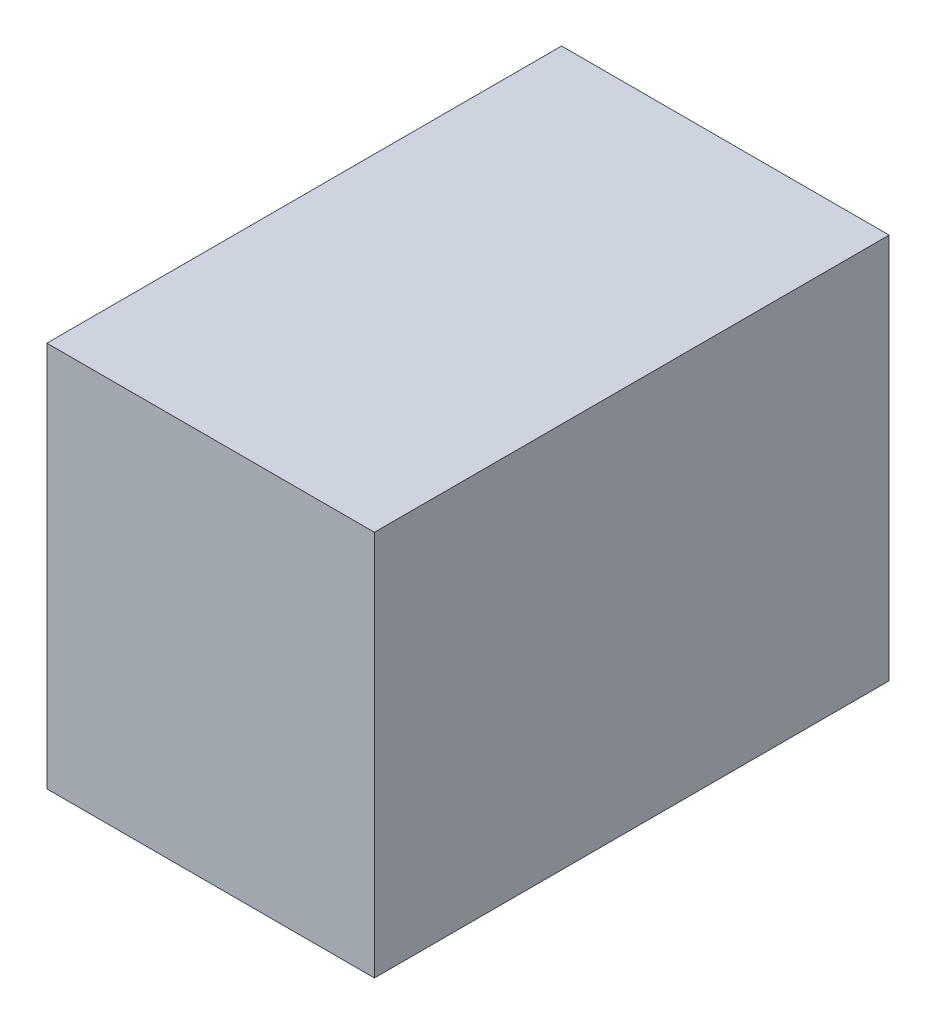
ISO-10303-21;
HEADER;
FILE_DESCRIPTION(('STEP AP214'),'2;1');
FILE_NAME('part.step','',(''),(''),'','','');
FILE_SCHEMA(('AUTOMOTIVE_DESIGN { 1 0 10303 214 1 1 1 1 }'));
ENDSEC;
DATA;
#1=APPLICATION_CONTEXT('core data for automotive mechanical design processes');
#2=APPLICATION_PROTOCOL_DEFINITION('international standard','automotive_design',2000,#1);
#3=PRODUCT_CONTEXT('',#1,'mechanical');
#4=PRODUCT('Part','Part','',(#3));
#5=PRODUCT_RELATED_PRODUCT_CATEGORY('part','',(#4));
#6=PRODUCT_DEFINITION_FORMATION('','',#4);
#7=PRODUCT_DEFINITION_CONTEXT('part definition',#1,'design');
#8=PRODUCT_DEFINITION('design','',#6,#7);
#9=PRODUCT_DEFINITION_SHAPE('','',#8);
#10=(LENGTH_UNIT() NAMED_UNIT(*) SI_UNIT(.MILLI.,.METRE.));
#11=(NAMED_UNIT(*) PLANE_ANGLE_UNIT() SI_UNIT($,.RADIAN.));
#12=(NAMED_UNIT(*) SI_UNIT($,.STERADIAN.) SOLID_ANGLE_UNIT());
#13=UNCERTAINTY_MEASURE_WITH_UNIT(LENGTH_MEASURE(1.E-05),#10,'distance_accuracy_value','');
#14=(GEOMETRIC_REPRESENTATION_CONTEXT(3) GLOBAL_UNCERTAINTY_ASSIGNED_CONTEXT((#13)) GLOBAL_UNIT_ASSIGNED_CONTEXT((#10,
#11,#12)) REPRESENTATION_CONTEXT('',''));
#15=CARTESIAN_POINT('',(0.,0.,0.));
#16=DIRECTION('',(0.,0.,1.));
#17=DIRECTION('',(1.,0.,0.));
#18=AXIS2_PLACEMENT_3D('',#15,#16,#17);
#19=CARTESIAN_POINT('',(-70.,165.,110.));
#20=DIRECTION('',(1.,0.,0.));
#21=DIRECTION('',(0.,0.,-1.));
#22=AXIS2_PLACEMENT_3D('',#19,#20,#21);
#23=PLANE('',#22);
#24=DIRECTION('',(0.,0.,1.));
#25=VECTOR('',#24,1.);
#26=CARTESIAN_POINT('',(-70.,0.,110.));
#27=LINE('',#26,#25);
#28=CARTESIAN_POINT('',(-70.,0.,-110.));
#29=VERTEX_POINT('',#28);
#30=CARTESIAN_POINT('',(-70.,0.,110.));
#31=VERTEX_POINT('',#30);
#32=EDGE_CURVE('E145',#29,#31,#27,.T.);
#33=ORIENTED_EDGE('',*,*,#32,.T.);
#34=DIRECTION('',(0.,-1.,0.));
#35=VECTOR('',#34,1.);
#36=CARTESIAN_POINT('',(-70.,165.,110.));
#37=LINE('',#36,#35);
#38=CARTESIAN_POINT('',(-70.,165.,110.));
#39=VERTEX_POINT('',#38);
#40=EDGE_CURVE('E11',#39,#31,#37,.T.);
#41=ORIENTED_EDGE('',*,*,#40,.F.);
#42=DIRECTION('',(0.,0.,1.));
#43=VECTOR('',#42,1.);
#44=CARTESIAN_POINT('',(-70.,165.,110.));
#45=LINE('',#44,#43);
#46=CARTESIAN_POINT('',(-70.,165.,-110.));
#47=VERTEX_POINT('',#46);
#48=EDGE_CURVE('E175',#47,#39,#45,.T.);
#49=ORIENTED_EDGE('',*,*,#48,.F.);
#50=DIRECTION('',(0.,-1.,0.));
#51=VECTOR('',#50,1.);
#52=CARTESIAN_POINT('',(-70.,165.,-110.));
#53=LINE('',#52,#51);
#54=EDGE_CURVE('E184',#47,#29,#53,.T.);
#55=ORIENTED_EDGE('',*,*,#54,.T.);
#56=EDGE_LOOP('',(#33,#41,#49,#55));
#57=FACE_BOUND('',#56,.T.);
#58=ADVANCED_FACE('F45',(#57),#23,.F.);
#59=CARTESIAN_POINT('',(70.,165.,110.));
#60=DIRECTION('',(0.,0.,-1.));
#61=DIRECTION('',(-1.,0.,0.));
#62=AXIS2_PLACEMENT_3D('',#59,#60,#61);
#63=PLANE('',#62);
#64=DIRECTION('',(1.,0.,0.));
#65=VECTOR('',#64,1.);
#66=CARTESIAN_POINT('',(70.,0.,110.));
#67=LINE('',#66,#65);
#68=CARTESIAN_POINT('',(70.,0.,110.));
#69=VERTEX_POINT('',#68);
#70=EDGE_CURVE('E151',#31,#69,#67,.T.);
#71=ORIENTED_EDGE('',*,*,#70,.T.);
#72=DIRECTION('',(0.,-1.,0.));
#73=VECTOR('',#72,1.);
#74=CARTESIAN_POINT('',(70.,165.,110.));
#75=LINE('',#74,#73);
#76=CARTESIAN_POINT('',(70.,165.,110.));
#77=VERTEX_POINT('',#76);
#78=EDGE_CURVE('E53',#77,#69,#75,.T.);
#79=ORIENTED_EDGE('',*,*,#78,.F.);
#80=DIRECTION('',(1.,0.,0.));
#81=VECTOR('',#80,1.);
#82=CARTESIAN_POINT('',(70.,165.,110.));
#83=LINE('',#82,#81);
#84=EDGE_CURVE('E97',#39,#77,#83,.T.);
#85=ORIENTED_EDGE('',*,*,#84,.F.);
#86=ORIENTED_EDGE('',*,*,#40,.T.);
#87=EDGE_LOOP('',(#71,#79,#85,#86));
#88=FACE_BOUND('',#87,.T.);
#89=ADVANCED_FACE('F219',(#88),#63,.F.);
#90=CARTESIAN_POINT('',(70.,165.,110.));
#91=DIRECTION('',(-1.,0.,0.));
#92=DIRECTION('',(0.,0.,1.));
#93=AXIS2_PLACEMENT_3D('',#90,#91,#92);
#94=PLANE('',#93);
#95=DIRECTION('',(0.,0.,-1.));
#96=VECTOR('',#95,1.);
#97=CARTESIAN_POINT('',(70.,0.,110.));
#98=LINE('',#97,#96);
#99=CARTESIAN_POINT('',(70.,0.,-110.));
#100=VERTEX_POINT('',#99);
#101=EDGE_CURVE('E188',#69,#100,#98,.T.);
#102=ORIENTED_EDGE('',*,*,#101,.T.);
#103=DIRECTION('',(0.,-1.,0.));
#104=VECTOR('',#103,1.);
#105=CARTESIAN_POINT('',(70.,165.,-110.));
#106=LINE('',#105,#104);
#107=CARTESIAN_POINT('',(70.,165.,-110.));
#108=VERTEX_POINT('',#107);
#109=EDGE_CURVE('E195',#108,#100,#106,.T.);
#110=ORIENTED_EDGE('',*,*,#109,.F.);
#111=DIRECTION('',(0.,0.,-1.));
#112=VECTOR('',#111,1.);
#113=CARTESIAN_POINT('',(70.,165.,110.));
#114=LINE('',#113,#112);
#115=EDGE_CURVE('E180',#77,#108,#114,.T.);
#116=ORIENTED_EDGE('',*,*,#115,.F.);
#117=ORIENTED_EDGE('',*,*,#78,.T.);
#118=EDGE_LOOP('',(#102,#110,#116,#117));
#119=FACE_BOUND('',#118,.T.);
#120=ADVANCED_FACE('F202',(#119),#94,.F.);
#121=CARTESIAN_POINT('',(70.,165.,-110.));
#122=DIRECTION('',(0.,0.,1.));
#123=DIRECTION('',(1.,0.,0.));
#124=AXIS2_PLACEMENT_3D('',#121,#122,#123);
#125=PLANE('',#124);
#126=DIRECTION('',(-1.,0.,0.));
#127=VECTOR('',#126,1.);
#128=CARTESIAN_POINT('',(70.,0.,-110.));
#129=LINE('',#128,#127);
#130=EDGE_CURVE('E90',#100,#29,#129,.T.);
#131=ORIENTED_EDGE('',*,*,#130,.T.);
#132=ORIENTED_EDGE('',*,*,#54,.F.);
#133=DIRECTION('',(-1.,0.,0.));
#134=VECTOR('',#133,1.);
#135=CARTESIAN_POINT('',(70.,165.,-110.));
#136=LINE('',#135,#134);
#137=EDGE_CURVE('E69',#108,#47,#136,.T.);
#138=ORIENTED_EDGE('',*,*,#137,.F.);
#139=ORIENTED_EDGE('',*,*,#109,.T.);
#140=EDGE_LOOP('',(#131,#132,#138,#139));
#141=FACE_BOUND('',#140,.T.);
#142=ADVANCED_FACE('F210',(#141),#125,.F.);
#143=CARTESIAN_POINT('',(0.,165.,0.));
#144=DIRECTION('',(0.,1.,0.));
#145=DIRECTION('',(0.,0.,1.));
#146=AXIS2_PLACEMENT_3D('',#143,#144,#145);
#147=PLANE('',#146);
#148=ORIENTED_EDGE('',*,*,#48,.T.);
#149=ORIENTED_EDGE('',*,*,#84,.T.);
#150=ORIENTED_EDGE('',*,*,#115,.T.);
#151=ORIENTED_EDGE('',*,*,#137,.T.);
#152=EDGE_LOOP('',(#148,#149,#150,#151));
#153=FACE_BOUND('',#152,.T.);
#154=ADVANCED_FACE('F212',(#153),#147,.T.);
#155=CARTESIAN_POINT('',(0.,0.,0.));
#156=DIRECTION('',(0.,1.,0.));
#157=DIRECTION('',(0.,0.,1.));
#158=AXIS2_PLACEMENT_3D('',#155,#156,#157);
#159=PLANE('',#158);
#160=DIRECTION('',(-1.,0.,0.));
#161=VECTOR('',#160,1.);
#162=CARTESIAN_POINT('',(70.,0.,-108.));
#163=LINE('',#162,#161);
#164=CARTESIAN_POINT('',(68.,0.,-108.));
#165=VERTEX_POINT('',#164);
#166=CARTESIAN_POINT('',(-68.,0.,-108.));
#167=VERTEX_POINT('',#166);
#168=EDGE_CURVE('E139',#165,#167,#163,.T.);
#169=ORIENTED_EDGE('',*,*,#168,.T.);
#170=DIRECTION('',(0.,0.,1.));
#171=VECTOR('',#170,1.);
#172=CARTESIAN_POINT('',(-68.,0.,110.));
#173=LINE('',#172,#171);
#174=CARTESIAN_POINT('',(-68.,0.,108.));
#175=VERTEX_POINT('',#174);
#176=EDGE_CURVE('E165',#167,#175,#173,.T.);
#177=ORIENTED_EDGE('',*,*,#176,.T.);
#178=DIRECTION('',(1.,0.,0.));
#179=VECTOR('',#178,1.);
#180=CARTESIAN_POINT('',(70.,0.,108.));
#181=LINE('',#180,#179);
#182=CARTESIAN_POINT('',(68.,0.,108.));
#183=VERTEX_POINT('',#182);
#184=EDGE_CURVE('E143',#175,#183,#181,.T.);
#185=ORIENTED_EDGE('',*,*,#184,.T.);
#186=DIRECTION('',(0.,0.,-1.));
#187=VECTOR('',#186,1.);
#188=CARTESIAN_POINT('',(68.,0.,110.));
#189=LINE('',#188,#187);
#190=EDGE_CURVE('E60',#183,#165,#189,.T.);
#191=ORIENTED_EDGE('',*,*,#190,.T.);
#192=EDGE_LOOP('',(#169,#177,#185,#191));
#193=FACE_BOUND('',#192,.T.);
#194=ORIENTED_EDGE('',*,*,#32,.F.);
#195=ORIENTED_EDGE('',*,*,#130,.F.);
#196=ORIENTED_EDGE('',*,*,#101,.F.);
#197=ORIENTED_EDGE('',*,*,#70,.F.);
#198=EDGE_LOOP('',(#194,#195,#196,#197));
#199=FACE_BOUND('',#198,.T.);
#200=ADVANCED_FACE('F206',(#193,#199),#159,.F.);
#201=CARTESIAN_POINT('',(-68.,165.,110.));
#202=DIRECTION('',(1.,0.,0.));
#203=DIRECTION('',(0.,0.,-1.));
#204=AXIS2_PLACEMENT_3D('',#201,#202,#203);
#205=PLANE('',#204);
#206=ORIENTED_EDGE('',*,*,#176,.F.);
#207=DIRECTION('',(0.,-1.,0.));
#208=VECTOR('',#207,1.);
#209=CARTESIAN_POINT('',(-68.,165.,-108.));
#210=LINE('',#209,#208);
#211=CARTESIAN_POINT('',(-68.,163.,-108.));
#212=VERTEX_POINT('',#211);
#213=EDGE_CURVE('E137',#212,#167,#210,.T.);
#214=ORIENTED_EDGE('',*,*,#213,.F.);
#215=DIRECTION('',(0.,0.,1.));
#216=VECTOR('',#215,1.);
#217=CARTESIAN_POINT('',(-68.,163.,110.));
#218=LINE('',#217,#216);
#219=CARTESIAN_POINT('',(-68.,163.,108.));
#220=VERTEX_POINT('',#219);
#221=EDGE_CURVE('E124',#212,#220,#218,.T.);
#222=ORIENTED_EDGE('',*,*,#221,.T.);
#223=DIRECTION('',(0.,-1.,0.));
#224=VECTOR('',#223,1.);
#225=CARTESIAN_POINT('',(-68.,165.,108.));
#226=LINE('',#225,#224);
#227=EDGE_CURVE('E135',#220,#175,#226,.T.);
#228=ORIENTED_EDGE('',*,*,#227,.T.);
#229=EDGE_LOOP('',(#206,#214,#222,#228));
#230=FACE_BOUND('',#229,.T.);
#231=ADVANCED_FACE('F134',(#230),#205,.T.);
#232=CARTESIAN_POINT('',(70.,165.,108.));
#233=DIRECTION('',(0.,0.,-1.));
#234=DIRECTION('',(-1.,0.,0.));
#235=AXIS2_PLACEMENT_3D('',#232,#233,#234);
#236=PLANE('',#235);
#237=ORIENTED_EDGE('',*,*,#184,.F.);
#238=ORIENTED_EDGE('',*,*,#227,.F.);
#239=DIRECTION('',(1.,0.,0.));
#240=VECTOR('',#239,1.);
#241=CARTESIAN_POINT('',(70.,163.,108.));
#242=LINE('',#241,#240);
#243=CARTESIAN_POINT('',(68.,163.,108.));
#244=VERTEX_POINT('',#243);
#245=EDGE_CURVE('E120',#220,#244,#242,.T.);
#246=ORIENTED_EDGE('',*,*,#245,.T.);
#247=DIRECTION('',(0.,-1.,0.));
#248=VECTOR('',#247,1.);
#249=CARTESIAN_POINT('',(68.,165.,108.));
#250=LINE('',#249,#248);
#251=EDGE_CURVE('E146',#244,#183,#250,.T.);
#252=ORIENTED_EDGE('',*,*,#251,.T.);
#253=EDGE_LOOP('',(#237,#238,#246,#252));
#254=FACE_BOUND('',#253,.T.);
#255=ADVANCED_FACE('F141',(#254),#236,.T.);
#256=CARTESIAN_POINT('',(68.,165.,110.));
#257=DIRECTION('',(-1.,0.,0.));
#258=DIRECTION('',(0.,0.,1.));
#259=AXIS2_PLACEMENT_3D('',#256,#257,#258);
#260=PLANE('',#259);
#261=ORIENTED_EDGE('',*,*,#190,.F.);
#262=ORIENTED_EDGE('',*,*,#251,.F.);
#263=DIRECTION('',(0.,0.,-1.));
#264=VECTOR('',#263,1.);
#265=CARTESIAN_POINT('',(68.,163.,110.));
#266=LINE('',#265,#264);
#267=CARTESIAN_POINT('',(68.,163.,-108.));
#268=VERTEX_POINT('',#267);
#269=EDGE_CURVE('E125',#244,#268,#266,.T.);
#270=ORIENTED_EDGE('',*,*,#269,.T.);
#271=DIRECTION('',(0.,-1.,0.));
#272=VECTOR('',#271,1.);
#273=CARTESIAN_POINT('',(68.,165.,-108.));
#274=LINE('',#273,#272);
#275=EDGE_CURVE('E153',#268,#165,#274,.T.);
#276=ORIENTED_EDGE('',*,*,#275,.T.);
#277=EDGE_LOOP('',(#261,#262,#270,#276));
#278=FACE_BOUND('',#277,.T.);
#279=ADVANCED_FACE('F269',(#278),#260,.T.);
#280=CARTESIAN_POINT('',(70.,165.,-108.));
#281=DIRECTION('',(0.,0.,1.));
#282=DIRECTION('',(1.,0.,0.));
#283=AXIS2_PLACEMENT_3D('',#280,#281,#282);
#284=PLANE('',#283);
#285=ORIENTED_EDGE('',*,*,#168,.F.);
#286=ORIENTED_EDGE('',*,*,#275,.F.);
#287=DIRECTION('',(-1.,0.,0.));
#288=VECTOR('',#287,1.);
#289=CARTESIAN_POINT('',(70.,163.,-108.));
#290=LINE('',#289,#288);
#291=EDGE_CURVE('E157',#268,#212,#290,.T.);
#292=ORIENTED_EDGE('',*,*,#291,.T.);
#293=ORIENTED_EDGE('',*,*,#213,.T.);
#294=EDGE_LOOP('',(#285,#286,#292,#293));
#295=FACE_BOUND('',#294,.T.);
#296=ADVANCED_FACE('F278',(#295),#284,.T.);
#297=CARTESIAN_POINT('',(0.,163.,0.));
#298=DIRECTION('',(0.,1.,0.));
#299=DIRECTION('',(0.,0.,1.));
#300=AXIS2_PLACEMENT_3D('',#297,#298,#299);
#301=PLANE('',#300);
#302=ORIENTED_EDGE('',*,*,#221,.F.);
#303=ORIENTED_EDGE('',*,*,#291,.F.);
#304=ORIENTED_EDGE('',*,*,#269,.F.);
#305=ORIENTED_EDGE('',*,*,#245,.F.);
#306=EDGE_LOOP('',(#302,#303,#304,#305));
#307=FACE_BOUND('',#306,.T.);
#308=ADVANCED_FACE('F122',(#307),#301,.F.);
#309=CLOSED_SHELL('',(#58,#89,#120,#142,#154,#200,#231,#255,#279,#296,#308));
#310=MANIFOLD_SOLID_BREP('B2',#309);
#311=ADVANCED_BREP_SHAPE_REPRESENTATION('',(#18,#310),#14);
#312=SHAPE_DEFINITION_REPRESENTATION(#9,#311);
ENDSEC;
END-ISO-10303-21;
